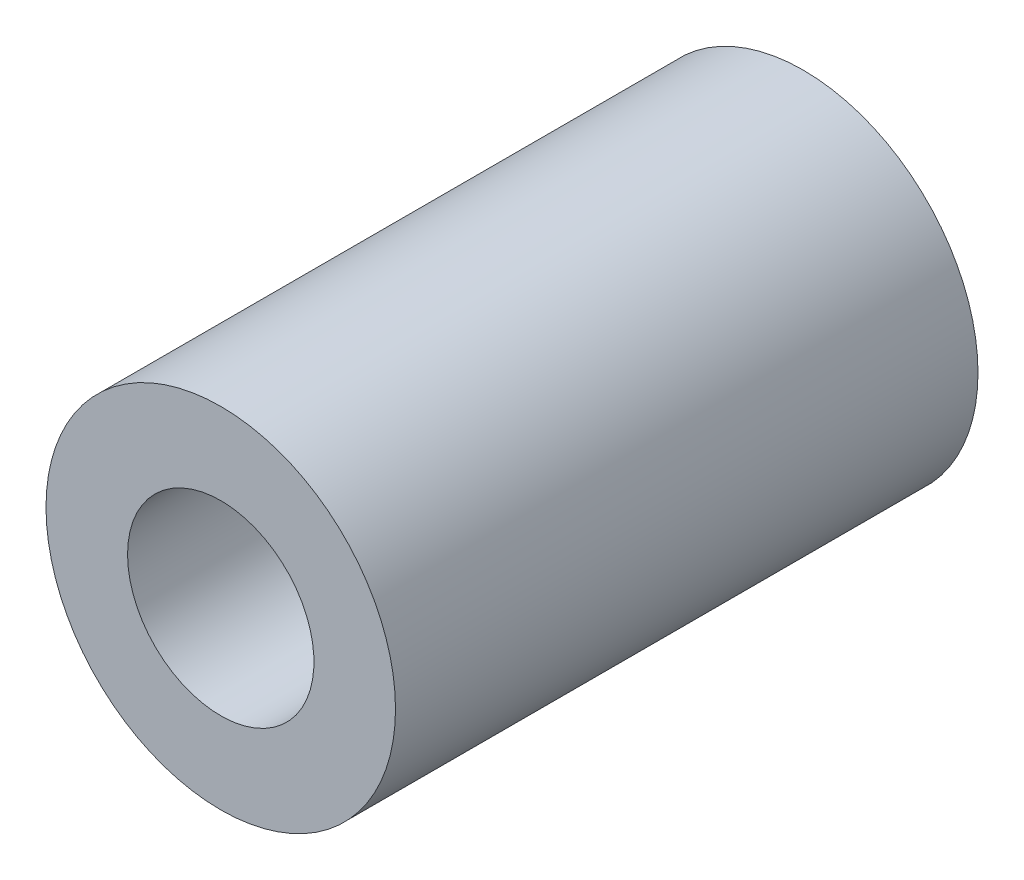
ISO-10303-21;
HEADER;
FILE_DESCRIPTION(('STEP AP214'),'2;1');
FILE_NAME('part.step','',(''),(''),'','','');
FILE_SCHEMA(('AUTOMOTIVE_DESIGN { 1 0 10303 214 1 1 1 1 }'));
ENDSEC;
DATA;
#1=APPLICATION_CONTEXT('core data for automotive mechanical design processes');
#2=APPLICATION_PROTOCOL_DEFINITION('international standard','automotive_design',2000,#1);
#3=PRODUCT_CONTEXT('',#1,'mechanical');
#4=PRODUCT('Part','Part','',(#3));
#5=PRODUCT_RELATED_PRODUCT_CATEGORY('part','',(#4));
#6=PRODUCT_DEFINITION_FORMATION('','',#4);
#7=PRODUCT_DEFINITION_CONTEXT('part definition',#1,'design');
#8=PRODUCT_DEFINITION('design','',#6,#7);
#9=PRODUCT_DEFINITION_SHAPE('','',#8);
#10=(LENGTH_UNIT() NAMED_UNIT(*) SI_UNIT(.MILLI.,.METRE.));
#11=(NAMED_UNIT(*) PLANE_ANGLE_UNIT() SI_UNIT($,.RADIAN.));
#12=(NAMED_UNIT(*) SI_UNIT($,.STERADIAN.) SOLID_ANGLE_UNIT());
#13=UNCERTAINTY_MEASURE_WITH_UNIT(LENGTH_MEASURE(1.E-05),#10,'distance_accuracy_value','');
#14=(GEOMETRIC_REPRESENTATION_CONTEXT(3) GLOBAL_UNCERTAINTY_ASSIGNED_CONTEXT((#13)) GLOBAL_UNIT_ASSIGNED_CONTEXT((#10,
#11,#12)) REPRESENTATION_CONTEXT('',''));
#15=CARTESIAN_POINT('',(0.,0.,0.));
#16=DIRECTION('',(0.,0.,1.));
#17=DIRECTION('',(1.,0.,0.));
#18=AXIS2_PLACEMENT_3D('',#15,#16,#17);
#19=CARTESIAN_POINT('',(0.,0.,10.));
#20=DIRECTION('',(0.,0.,-1.));
#21=DIRECTION('',(-1.,0.,0.));
#22=AXIS2_PLACEMENT_3D('',#19,#20,#21);
#23=CYLINDRICAL_SURFACE('',#22,3.);
#24=CARTESIAN_POINT('',(0.,0.,10.));
#25=DIRECTION('',(0.,0.,1.));
#26=DIRECTION('',(1.,0.,0.));
#27=AXIS2_PLACEMENT_3D('',#24,#25,#26);
#28=CIRCLE('',#27,3.);
#29=CARTESIAN_POINT('',(3.,0.,10.));
#30=VERTEX_POINT('',#29);
#31=EDGE_CURVE('E10',#30,#30,#28,.T.);
#32=ORIENTED_EDGE('',*,*,#31,.F.);
#33=EDGE_LOOP('',(#32));
#34=FACE_BOUND('',#33,.T.);
#35=CARTESIAN_POINT('',(0.,0.,0.));
#36=DIRECTION('',(0.,0.,1.));
#37=DIRECTION('',(1.,0.,0.));
#38=AXIS2_PLACEMENT_3D('',#35,#36,#37);
#39=CIRCLE('',#38,3.);
#40=CARTESIAN_POINT('',(3.,0.,0.));
#41=VERTEX_POINT('',#40);
#42=EDGE_CURVE('E36',#41,#41,#39,.T.);
#43=ORIENTED_EDGE('',*,*,#42,.T.);
#44=EDGE_LOOP('',(#43));
#45=FACE_BOUND('',#44,.T.);
#46=ADVANCED_FACE('F33',(#34,#45),#23,.T.);
#47=CARTESIAN_POINT('',(0.,0.,10.));
#48=DIRECTION('',(0.,0.,1.));
#49=DIRECTION('',(1.,0.,0.));
#50=AXIS2_PLACEMENT_3D('',#47,#48,#49);
#51=PLANE('',#50);
#52=CARTESIAN_POINT('',(0.,0.,10.));
#53=DIRECTION('',(0.,0.,-1.));
#54=DIRECTION('',(-1.,0.,0.));
#55=AXIS2_PLACEMENT_3D('',#52,#53,#54);
#56=CIRCLE('',#55,1.6);
#57=CARTESIAN_POINT('',(-1.6,0.,10.));
#58=VERTEX_POINT('',#57);
#59=EDGE_CURVE('E43',#58,#58,#56,.T.);
#60=ORIENTED_EDGE('',*,*,#59,.T.);
#61=EDGE_LOOP('',(#60));
#62=FACE_BOUND('',#61,.T.);
#63=ORIENTED_EDGE('',*,*,#31,.T.);
#64=EDGE_LOOP('',(#63));
#65=FACE_BOUND('',#64,.T.);
#66=ADVANCED_FACE('F51',(#62,#65),#51,.T.);
#67=CARTESIAN_POINT('',(0.,0.,0.));
#68=DIRECTION('',(0.,0.,1.));
#69=DIRECTION('',(1.,0.,0.));
#70=AXIS2_PLACEMENT_3D('',#67,#68,#69);
#71=PLANE('',#70);
#72=CARTESIAN_POINT('',(0.,0.,0.));
#73=DIRECTION('',(0.,0.,-1.));
#74=DIRECTION('',(-1.,0.,0.));
#75=AXIS2_PLACEMENT_3D('',#72,#73,#74);
#76=CIRCLE('',#75,1.6);
#77=CARTESIAN_POINT('',(-1.6,0.,0.));
#78=VERTEX_POINT('',#77);
#79=EDGE_CURVE('E45',#78,#78,#76,.T.);
#80=ORIENTED_EDGE('',*,*,#79,.F.);
#81=EDGE_LOOP('',(#80));
#82=FACE_BOUND('',#81,.T.);
#83=ORIENTED_EDGE('',*,*,#42,.F.);
#84=EDGE_LOOP('',(#83));
#85=FACE_BOUND('',#84,.T.);
#86=ADVANCED_FACE('F56',(#82,#85),#71,.F.);
#87=CARTESIAN_POINT('',(0.,0.,10.));
#88=DIRECTION('',(0.,0.,-1.));
#89=DIRECTION('',(-1.,0.,0.));
#90=AXIS2_PLACEMENT_3D('',#87,#88,#89);
#91=CYLINDRICAL_SURFACE('',#90,1.6);
#92=ORIENTED_EDGE('',*,*,#59,.F.);
#93=EDGE_LOOP('',(#92));
#94=FACE_BOUND('',#93,.T.);
#95=ORIENTED_EDGE('',*,*,#79,.T.);
#96=EDGE_LOOP('',(#95));
#97=FACE_BOUND('',#96,.T.);
#98=ADVANCED_FACE('F53',(#94,#97),#91,.F.);
#99=CLOSED_SHELL('',(#46,#66,#86,#98));
#100=MANIFOLD_SOLID_BREP('B2',#99);
#101=ADVANCED_BREP_SHAPE_REPRESENTATION('',(#18,#100),#14);
#102=SHAPE_DEFINITION_REPRESENTATION(#9,#101);
ENDSEC;
END-ISO-10303-21;
